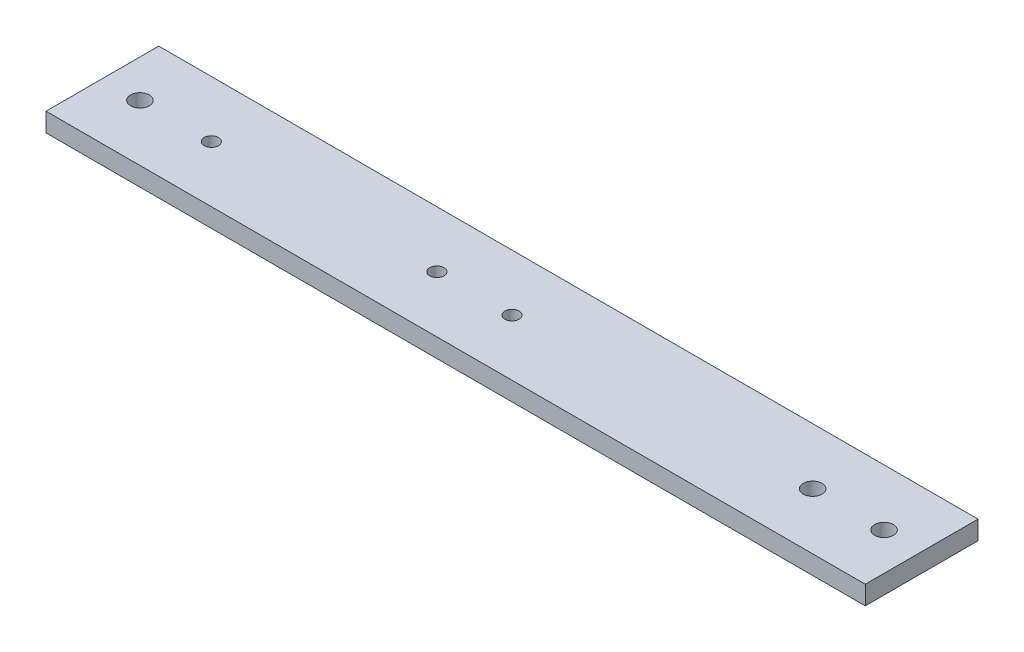
ISO-10303-21;
HEADER;
FILE_DESCRIPTION(('STEP AP214'),'2;1');
FILE_NAME('part.step','',(''),(''),'','','');
FILE_SCHEMA(('AUTOMOTIVE_DESIGN { 1 0 10303 214 1 1 1 1 }'));
ENDSEC;
DATA;
#1=APPLICATION_CONTEXT('core data for automotive mechanical design processes');
#2=APPLICATION_PROTOCOL_DEFINITION('international standard','automotive_design',2000,#1);
#3=PRODUCT_CONTEXT('',#1,'mechanical');
#4=PRODUCT('Part','Part','',(#3));
#5=PRODUCT_RELATED_PRODUCT_CATEGORY('part','',(#4));
#6=PRODUCT_DEFINITION_FORMATION('','',#4);
#7=PRODUCT_DEFINITION_CONTEXT('part definition',#1,'design');
#8=PRODUCT_DEFINITION('design','',#6,#7);
#9=PRODUCT_DEFINITION_SHAPE('','',#8);
#10=(LENGTH_UNIT() NAMED_UNIT(*) SI_UNIT(.MILLI.,.METRE.));
#11=(NAMED_UNIT(*) PLANE_ANGLE_UNIT() SI_UNIT($,.RADIAN.));
#12=(NAMED_UNIT(*) SI_UNIT($,.STERADIAN.) SOLID_ANGLE_UNIT());
#13=UNCERTAINTY_MEASURE_WITH_UNIT(LENGTH_MEASURE(1.E-05),#10,'distance_accuracy_value','');
#14=(GEOMETRIC_REPRESENTATION_CONTEXT(3) GLOBAL_UNCERTAINTY_ASSIGNED_CONTEXT((#13)) GLOBAL_UNIT_ASSIGNED_CONTEXT((#10,
#11,#12)) REPRESENTATION_CONTEXT('',''));
#15=CARTESIAN_POINT('',(0.,0.,0.));
#16=DIRECTION('',(0.,0.,1.));
#17=DIRECTION('',(1.,0.,0.));
#18=AXIS2_PLACEMENT_3D('',#15,#16,#17);
#19=CARTESIAN_POINT('',(0.,6.35,0.));
#20=DIRECTION('',(0.,-1.,0.));
#21=DIRECTION('',(0.,0.,-1.));
#22=AXIS2_PLACEMENT_3D('',#19,#20,#21);
#23=PLANE('',#22);
#24=DIRECTION('',(0.,0.,-1.));
#25=VECTOR('',#24,1.);
#26=CARTESIAN_POINT('',(138.43,6.35,19.05));
#27=LINE('',#26,#25);
#28=CARTESIAN_POINT('',(138.43,6.35,19.05));
#29=VERTEX_POINT('',#28);
#30=CARTESIAN_POINT('',(138.43,6.35,-19.05));
#31=VERTEX_POINT('',#30);
#32=EDGE_CURVE('E85',#29,#31,#27,.T.);
#33=ORIENTED_EDGE('',*,*,#32,.T.);
#34=DIRECTION('',(-1.,0.,0.));
#35=VECTOR('',#34,1.);
#36=CARTESIAN_POINT('',(-138.43,6.35,-19.05));
#37=LINE('',#36,#35);
#38=CARTESIAN_POINT('',(-138.43,6.35,-19.05));
#39=VERTEX_POINT('',#38);
#40=EDGE_CURVE('E80',#31,#39,#37,.T.);
#41=ORIENTED_EDGE('',*,*,#40,.T.);
#42=DIRECTION('',(0.,0.,1.));
#43=VECTOR('',#42,1.);
#44=CARTESIAN_POINT('',(-138.43,6.35,19.05));
#45=LINE('',#44,#43);
#46=CARTESIAN_POINT('',(-138.43,6.35,19.05));
#47=VERTEX_POINT('',#46);
#48=EDGE_CURVE('E83',#39,#47,#45,.T.);
#49=ORIENTED_EDGE('',*,*,#48,.T.);
#50=DIRECTION('',(1.,0.,0.));
#51=VECTOR('',#50,1.);
#52=CARTESIAN_POINT('',(-138.43,6.35,19.05));
#53=LINE('',#52,#51);
#54=EDGE_CURVE('E50',#47,#29,#53,.T.);
#55=ORIENTED_EDGE('',*,*,#54,.T.);
#56=EDGE_LOOP('',(#33,#41,#49,#55));
#57=FACE_BOUND('',#56,.T.);
#58=CARTESIAN_POINT('',(-125.73,6.35,0.));
#59=DIRECTION('',(0.,1.,0.));
#60=DIRECTION('',(0.,0.,1.));
#61=AXIS2_PLACEMENT_3D('',#58,#59,#60);
#62=CIRCLE('',#61,3.175);
#63=CARTESIAN_POINT('',(-125.73,6.35,3.175));
#64=VERTEX_POINT('',#63);
#65=EDGE_CURVE('E100',#64,#64,#62,.T.);
#66=ORIENTED_EDGE('',*,*,#65,.F.);
#67=EDGE_LOOP('',(#66));
#68=FACE_BOUND('',#67,.T.);
#69=CARTESIAN_POINT('',(125.73,6.35,0.));
#70=DIRECTION('',(0.,1.,0.));
#71=DIRECTION('',(0.,0.,1.));
#72=AXIS2_PLACEMENT_3D('',#69,#70,#71);
#73=CIRCLE('',#72,3.17499999999997);
#74=CARTESIAN_POINT('',(125.73,6.35,3.17499999999997));
#75=VERTEX_POINT('',#74);
#76=EDGE_CURVE('E115',#75,#75,#73,.T.);
#77=ORIENTED_EDGE('',*,*,#76,.F.);
#78=EDGE_LOOP('',(#77));
#79=FACE_BOUND('',#78,.T.);
#80=CARTESIAN_POINT('',(-101.6,6.35,0.));
#81=DIRECTION('',(0.,1.,0.));
#82=DIRECTION('',(0.,0.,1.));
#83=AXIS2_PLACEMENT_3D('',#80,#81,#82);
#84=CIRCLE('',#83,2.413);
#85=CARTESIAN_POINT('',(-101.6,6.35,2.413));
#86=VERTEX_POINT('',#85);
#87=EDGE_CURVE('E121',#86,#86,#84,.T.);
#88=ORIENTED_EDGE('',*,*,#87,.F.);
#89=EDGE_LOOP('',(#88));
#90=FACE_BOUND('',#89,.T.);
#91=CARTESIAN_POINT('',(-25.4,6.35,0.));
#92=DIRECTION('',(0.,1.,0.));
#93=DIRECTION('',(0.,0.,1.));
#94=AXIS2_PLACEMENT_3D('',#91,#92,#93);
#95=CIRCLE('',#94,2.413);
#96=CARTESIAN_POINT('',(-25.4,6.35,2.413));
#97=VERTEX_POINT('',#96);
#98=EDGE_CURVE('E127',#97,#97,#95,.T.);
#99=ORIENTED_EDGE('',*,*,#98,.F.);
#100=EDGE_LOOP('',(#99));
#101=FACE_BOUND('',#100,.T.);
#102=CARTESIAN_POINT('',(0.,6.35,0.));
#103=DIRECTION('',(0.,1.,0.));
#104=DIRECTION('',(0.,0.,1.));
#105=AXIS2_PLACEMENT_3D('',#102,#103,#104);
#106=CIRCLE('',#105,2.413);
#107=CARTESIAN_POINT('',(0.,6.35,2.413));
#108=VERTEX_POINT('',#107);
#109=EDGE_CURVE('E133',#108,#108,#106,.T.);
#110=ORIENTED_EDGE('',*,*,#109,.F.);
#111=EDGE_LOOP('',(#110));
#112=FACE_BOUND('',#111,.T.);
#113=CARTESIAN_POINT('',(101.6,6.35,0.));
#114=DIRECTION('',(0.,1.,0.));
#115=DIRECTION('',(0.,0.,1.));
#116=AXIS2_PLACEMENT_3D('',#113,#114,#115);
#117=CIRCLE('',#116,3.175);
#118=CARTESIAN_POINT('',(101.6,6.35,3.175));
#119=VERTEX_POINT('',#118);
#120=EDGE_CURVE('E139',#119,#119,#117,.T.);
#121=ORIENTED_EDGE('',*,*,#120,.F.);
#122=EDGE_LOOP('',(#121));
#123=FACE_BOUND('',#122,.T.);
#124=ADVANCED_FACE('F33',(#57,#68,#79,#90,#101,#112,#123),#23,.F.);
#125=CARTESIAN_POINT('',(0.,0.,0.));
#126=DIRECTION('',(0.,-1.,0.));
#127=DIRECTION('',(0.,0.,-1.));
#128=AXIS2_PLACEMENT_3D('',#125,#126,#127);
#129=PLANE('',#128);
#130=CARTESIAN_POINT('',(0.,0.,0.));
#131=DIRECTION('',(0.,1.,0.));
#132=DIRECTION('',(0.,0.,1.));
#133=AXIS2_PLACEMENT_3D('',#130,#131,#132);
#134=CIRCLE('',#133,2.413);
#135=CARTESIAN_POINT('',(0.,0.,2.413));
#136=VERTEX_POINT('',#135);
#137=EDGE_CURVE('E136',#136,#136,#134,.T.);
#138=ORIENTED_EDGE('',*,*,#137,.T.);
#139=EDGE_LOOP('',(#138));
#140=FACE_BOUND('',#139,.T.);
#141=CARTESIAN_POINT('',(-101.6,0.,0.));
#142=DIRECTION('',(0.,1.,0.));
#143=DIRECTION('',(0.,0.,1.));
#144=AXIS2_PLACEMENT_3D('',#141,#142,#143);
#145=CIRCLE('',#144,2.413);
#146=CARTESIAN_POINT('',(-101.6,0.,2.413));
#147=VERTEX_POINT('',#146);
#148=EDGE_CURVE('E124',#147,#147,#145,.T.);
#149=ORIENTED_EDGE('',*,*,#148,.T.);
#150=EDGE_LOOP('',(#149));
#151=FACE_BOUND('',#150,.T.);
#152=CARTESIAN_POINT('',(-125.73,0.,0.));
#153=DIRECTION('',(0.,1.,0.));
#154=DIRECTION('',(0.,0.,1.));
#155=AXIS2_PLACEMENT_3D('',#152,#153,#154);
#156=CIRCLE('',#155,3.175);
#157=CARTESIAN_POINT('',(-125.73,0.,3.175));
#158=VERTEX_POINT('',#157);
#159=EDGE_CURVE('E112',#158,#158,#156,.T.);
#160=ORIENTED_EDGE('',*,*,#159,.T.);
#161=EDGE_LOOP('',(#160));
#162=FACE_BOUND('',#161,.T.);
#163=DIRECTION('',(0.,0.,-1.));
#164=VECTOR('',#163,1.);
#165=CARTESIAN_POINT('',(138.43,0.,19.05));
#166=LINE('',#165,#164);
#167=CARTESIAN_POINT('',(138.43,0.,19.05));
#168=VERTEX_POINT('',#167);
#169=CARTESIAN_POINT('',(138.43,0.,-19.05));
#170=VERTEX_POINT('',#169);
#171=EDGE_CURVE('E97',#168,#170,#166,.T.);
#172=ORIENTED_EDGE('',*,*,#171,.F.);
#173=DIRECTION('',(1.,0.,0.));
#174=VECTOR('',#173,1.);
#175=CARTESIAN_POINT('',(-138.43,0.,19.05));
#176=LINE('',#175,#174);
#177=CARTESIAN_POINT('',(-138.43,0.,19.05));
#178=VERTEX_POINT('',#177);
#179=EDGE_CURVE('E73',#178,#168,#176,.T.);
#180=ORIENTED_EDGE('',*,*,#179,.F.);
#181=DIRECTION('',(0.,0.,1.));
#182=VECTOR('',#181,1.);
#183=CARTESIAN_POINT('',(-138.43,0.,19.05));
#184=LINE('',#183,#182);
#185=CARTESIAN_POINT('',(-138.43,0.,-19.05));
#186=VERTEX_POINT('',#185);
#187=EDGE_CURVE('E67',#186,#178,#184,.T.);
#188=ORIENTED_EDGE('',*,*,#187,.F.);
#189=DIRECTION('',(-1.,0.,0.));
#190=VECTOR('',#189,1.);
#191=CARTESIAN_POINT('',(-138.43,0.,-19.05));
#192=LINE('',#191,#190);
#193=EDGE_CURVE('E89',#170,#186,#192,.T.);
#194=ORIENTED_EDGE('',*,*,#193,.F.);
#195=EDGE_LOOP('',(#172,#180,#188,#194));
#196=FACE_BOUND('',#195,.T.);
#197=CARTESIAN_POINT('',(125.73,0.,0.));
#198=DIRECTION('',(0.,1.,0.));
#199=DIRECTION('',(0.,0.,1.));
#200=AXIS2_PLACEMENT_3D('',#197,#198,#199);
#201=CIRCLE('',#200,3.17499999999997);
#202=CARTESIAN_POINT('',(125.73,0.,3.17499999999997));
#203=VERTEX_POINT('',#202);
#204=EDGE_CURVE('E118',#203,#203,#201,.T.);
#205=ORIENTED_EDGE('',*,*,#204,.T.);
#206=EDGE_LOOP('',(#205));
#207=FACE_BOUND('',#206,.T.);
#208=CARTESIAN_POINT('',(-25.4,0.,0.));
#209=DIRECTION('',(0.,1.,0.));
#210=DIRECTION('',(0.,0.,1.));
#211=AXIS2_PLACEMENT_3D('',#208,#209,#210);
#212=CIRCLE('',#211,2.413);
#213=CARTESIAN_POINT('',(-25.4,0.,2.413));
#214=VERTEX_POINT('',#213);
#215=EDGE_CURVE('E130',#214,#214,#212,.T.);
#216=ORIENTED_EDGE('',*,*,#215,.T.);
#217=EDGE_LOOP('',(#216));
#218=FACE_BOUND('',#217,.T.);
#219=CARTESIAN_POINT('',(101.6,0.,0.));
#220=DIRECTION('',(0.,1.,0.));
#221=DIRECTION('',(0.,0.,1.));
#222=AXIS2_PLACEMENT_3D('',#219,#220,#221);
#223=CIRCLE('',#222,3.175);
#224=CARTESIAN_POINT('',(101.6,0.,3.175));
#225=VERTEX_POINT('',#224);
#226=EDGE_CURVE('E142',#225,#225,#223,.T.);
#227=ORIENTED_EDGE('',*,*,#226,.T.);
#228=EDGE_LOOP('',(#227));
#229=FACE_BOUND('',#228,.T.);
#230=ADVANCED_FACE('F108',(#140,#151,#162,#196,#207,#218,#229),#129,.T.);
#231=CARTESIAN_POINT('',(138.43,6.35,19.05));
#232=DIRECTION('',(-1.,0.,0.));
#233=DIRECTION('',(0.,0.,1.));
#234=AXIS2_PLACEMENT_3D('',#231,#232,#233);
#235=PLANE('',#234);
#236=ORIENTED_EDGE('',*,*,#171,.T.);
#237=DIRECTION('',(0.,-1.,0.));
#238=VECTOR('',#237,1.);
#239=CARTESIAN_POINT('',(138.43,6.35,-19.05));
#240=LINE('',#239,#238);
#241=EDGE_CURVE('E11',#31,#170,#240,.T.);
#242=ORIENTED_EDGE('',*,*,#241,.F.);
#243=ORIENTED_EDGE('',*,*,#32,.F.);
#244=DIRECTION('',(0.,-1.,0.));
#245=VECTOR('',#244,1.);
#246=CARTESIAN_POINT('',(138.43,6.35,19.05));
#247=LINE('',#246,#245);
#248=EDGE_CURVE('E93',#29,#168,#247,.T.);
#249=ORIENTED_EDGE('',*,*,#248,.T.);
#250=EDGE_LOOP('',(#236,#242,#243,#249));
#251=FACE_BOUND('',#250,.T.);
#252=ADVANCED_FACE('F35',(#251),#235,.F.);
#253=CARTESIAN_POINT('',(-138.43,6.35,-19.05));
#254=DIRECTION('',(0.,0.,1.));
#255=DIRECTION('',(1.,0.,0.));
#256=AXIS2_PLACEMENT_3D('',#253,#254,#255);
#257=PLANE('',#256);
#258=ORIENTED_EDGE('',*,*,#193,.T.);
#259=DIRECTION('',(0.,-1.,0.));
#260=VECTOR('',#259,1.);
#261=CARTESIAN_POINT('',(-138.43,6.35,-19.05));
#262=LINE('',#261,#260);
#263=EDGE_CURVE('E42',#39,#186,#262,.T.);
#264=ORIENTED_EDGE('',*,*,#263,.F.);
#265=ORIENTED_EDGE('',*,*,#40,.F.);
#266=ORIENTED_EDGE('',*,*,#241,.T.);
#267=EDGE_LOOP('',(#258,#264,#265,#266));
#268=FACE_BOUND('',#267,.T.);
#269=ADVANCED_FACE('F88',(#268),#257,.F.);
#270=CARTESIAN_POINT('',(-138.43,6.35,19.05));
#271=DIRECTION('',(1.,0.,0.));
#272=DIRECTION('',(0.,0.,-1.));
#273=AXIS2_PLACEMENT_3D('',#270,#271,#272);
#274=PLANE('',#273);
#275=ORIENTED_EDGE('',*,*,#187,.T.);
#276=DIRECTION('',(0.,-1.,0.));
#277=VECTOR('',#276,1.);
#278=CARTESIAN_POINT('',(-138.43,6.35,19.05));
#279=LINE('',#278,#277);
#280=EDGE_CURVE('E90',#47,#178,#279,.T.);
#281=ORIENTED_EDGE('',*,*,#280,.F.);
#282=ORIENTED_EDGE('',*,*,#48,.F.);
#283=ORIENTED_EDGE('',*,*,#263,.T.);
#284=EDGE_LOOP('',(#275,#281,#282,#283));
#285=FACE_BOUND('',#284,.T.);
#286=ADVANCED_FACE('F91',(#285),#274,.F.);
#287=CARTESIAN_POINT('',(-138.43,6.35,19.05));
#288=DIRECTION('',(0.,0.,-1.));
#289=DIRECTION('',(-1.,0.,0.));
#290=AXIS2_PLACEMENT_3D('',#287,#288,#289);
#291=PLANE('',#290);
#292=ORIENTED_EDGE('',*,*,#179,.T.);
#293=ORIENTED_EDGE('',*,*,#248,.F.);
#294=ORIENTED_EDGE('',*,*,#54,.F.);
#295=ORIENTED_EDGE('',*,*,#280,.T.);
#296=EDGE_LOOP('',(#292,#293,#294,#295));
#297=FACE_BOUND('',#296,.T.);
#298=ADVANCED_FACE('F105',(#297),#291,.F.);
#299=CARTESIAN_POINT('',(-125.73,6.35,0.));
#300=DIRECTION('',(0.,-1.,0.));
#301=DIRECTION('',(0.,0.,-1.));
#302=AXIS2_PLACEMENT_3D('',#299,#300,#301);
#303=CYLINDRICAL_SURFACE('',#302,3.175);
#304=ORIENTED_EDGE('',*,*,#65,.T.);
#305=EDGE_LOOP('',(#304));
#306=FACE_BOUND('',#305,.T.);
#307=ORIENTED_EDGE('',*,*,#159,.F.);
#308=EDGE_LOOP('',(#307));
#309=FACE_BOUND('',#308,.T.);
#310=ADVANCED_FACE('F159',(#306,#309),#303,.F.);
#311=CARTESIAN_POINT('',(125.73,6.35,0.));
#312=DIRECTION('',(0.,-1.,0.));
#313=DIRECTION('',(0.,0.,-1.));
#314=AXIS2_PLACEMENT_3D('',#311,#312,#313);
#315=CYLINDRICAL_SURFACE('',#314,3.17499999999997);
#316=ORIENTED_EDGE('',*,*,#76,.T.);
#317=EDGE_LOOP('',(#316));
#318=FACE_BOUND('',#317,.T.);
#319=ORIENTED_EDGE('',*,*,#204,.F.);
#320=EDGE_LOOP('',(#319));
#321=FACE_BOUND('',#320,.T.);
#322=ADVANCED_FACE('F205',(#318,#321),#315,.F.);
#323=CARTESIAN_POINT('',(-101.6,6.35,0.));
#324=DIRECTION('',(0.,-1.,0.));
#325=DIRECTION('',(0.,0.,-1.));
#326=AXIS2_PLACEMENT_3D('',#323,#324,#325);
#327=CYLINDRICAL_SURFACE('',#326,2.413);
#328=ORIENTED_EDGE('',*,*,#87,.T.);
#329=EDGE_LOOP('',(#328));
#330=FACE_BOUND('',#329,.T.);
#331=ORIENTED_EDGE('',*,*,#148,.F.);
#332=EDGE_LOOP('',(#331));
#333=FACE_BOUND('',#332,.T.);
#334=ADVANCED_FACE('F213',(#330,#333),#327,.F.);
#335=CARTESIAN_POINT('',(-25.4,6.35,0.));
#336=DIRECTION('',(0.,-1.,0.));
#337=DIRECTION('',(0.,0.,-1.));
#338=AXIS2_PLACEMENT_3D('',#335,#336,#337);
#339=CYLINDRICAL_SURFACE('',#338,2.413);
#340=ORIENTED_EDGE('',*,*,#98,.T.);
#341=EDGE_LOOP('',(#340));
#342=FACE_BOUND('',#341,.T.);
#343=ORIENTED_EDGE('',*,*,#215,.F.);
#344=EDGE_LOOP('',(#343));
#345=FACE_BOUND('',#344,.T.);
#346=ADVANCED_FACE('F221',(#342,#345),#339,.F.);
#347=CARTESIAN_POINT('',(0.,6.35,0.));
#348=DIRECTION('',(0.,-1.,0.));
#349=DIRECTION('',(0.,0.,-1.));
#350=AXIS2_PLACEMENT_3D('',#347,#348,#349);
#351=CYLINDRICAL_SURFACE('',#350,2.413);
#352=ORIENTED_EDGE('',*,*,#109,.T.);
#353=EDGE_LOOP('',(#352));
#354=FACE_BOUND('',#353,.T.);
#355=ORIENTED_EDGE('',*,*,#137,.F.);
#356=EDGE_LOOP('',(#355));
#357=FACE_BOUND('',#356,.T.);
#358=ADVANCED_FACE('F230',(#354,#357),#351,.F.);
#359=CARTESIAN_POINT('',(101.6,6.35,0.));
#360=DIRECTION('',(0.,-1.,0.));
#361=DIRECTION('',(0.,0.,-1.));
#362=AXIS2_PLACEMENT_3D('',#359,#360,#361);
#363=CYLINDRICAL_SURFACE('',#362,3.175);
#364=ORIENTED_EDGE('',*,*,#120,.T.);
#365=EDGE_LOOP('',(#364));
#366=FACE_BOUND('',#365,.T.);
#367=ORIENTED_EDGE('',*,*,#226,.F.);
#368=EDGE_LOOP('',(#367));
#369=FACE_BOUND('',#368,.T.);
#370=ADVANCED_FACE('F148',(#366,#369),#363,.F.);
#371=CLOSED_SHELL('',(#124,#230,#252,#269,#286,#298,#310,#322,#334,#346,#358,#370));
#372=MANIFOLD_SOLID_BREP('B2',#371);
#373=ADVANCED_BREP_SHAPE_REPRESENTATION('',(#18,#372),#14);
#374=SHAPE_DEFINITION_REPRESENTATION(#9,#373);
ENDSEC;
END-ISO-10303-21;
